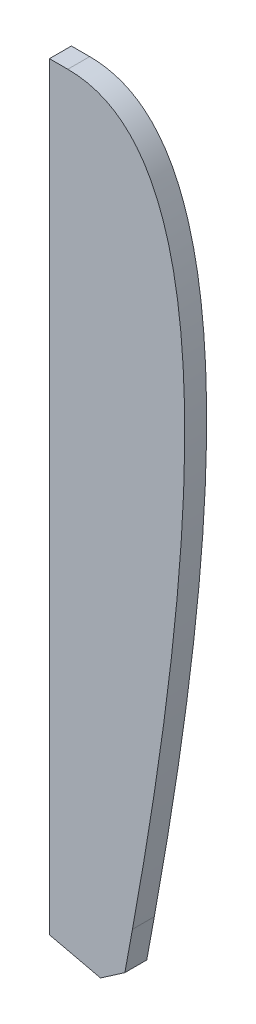
ISO-10303-21;
HEADER;
FILE_DESCRIPTION(('STEP AP214'),'2;1');
FILE_NAME('part.step','',(''),(''),'','','');
FILE_SCHEMA(('AUTOMOTIVE_DESIGN { 1 0 10303 214 1 1 1 1 }'));
ENDSEC;
DATA;
#1=APPLICATION_CONTEXT('core data for automotive mechanical design processes');
#2=APPLICATION_PROTOCOL_DEFINITION('international standard','automotive_design',2000,#1);
#3=PRODUCT_CONTEXT('',#1,'mechanical');
#4=PRODUCT('Part','Part','',(#3));
#5=PRODUCT_RELATED_PRODUCT_CATEGORY('part','',(#4));
#6=PRODUCT_DEFINITION_FORMATION('','',#4);
#7=PRODUCT_DEFINITION_CONTEXT('part definition',#1,'design');
#8=PRODUCT_DEFINITION('design','',#6,#7);
#9=PRODUCT_DEFINITION_SHAPE('','',#8);
#10=(LENGTH_UNIT() NAMED_UNIT(*) SI_UNIT(.MILLI.,.METRE.));
#11=(NAMED_UNIT(*) PLANE_ANGLE_UNIT() SI_UNIT($,.RADIAN.));
#12=(NAMED_UNIT(*) SI_UNIT($,.STERADIAN.) SOLID_ANGLE_UNIT());
#13=UNCERTAINTY_MEASURE_WITH_UNIT(LENGTH_MEASURE(1.E-05),#10,'distance_accuracy_value','');
#14=(GEOMETRIC_REPRESENTATION_CONTEXT(3) GLOBAL_UNCERTAINTY_ASSIGNED_CONTEXT((#13)) GLOBAL_UNIT_ASSIGNED_CONTEXT((#10,
#11,#12)) REPRESENTATION_CONTEXT('',''));
#15=CARTESIAN_POINT('',(0.,0.,0.));
#16=DIRECTION('',(0.,0.,1.));
#17=DIRECTION('',(1.,0.,0.));
#18=AXIS2_PLACEMENT_3D('',#15,#16,#17);
#19=CARTESIAN_POINT('',(12.7000000000002,-5480.41653499652,-12.7));
#20=DIRECTION('',(-1.,0.,0.));
#21=DIRECTION('',(0.,-1.,0.));
#22=AXIS2_PLACEMENT_3D('',#19,#20,#21);
#23=PLANE('',#22);
#24=DIRECTION('',(0.,-1.,0.));
#25=VECTOR('',#24,1.);
#26=CARTESIAN_POINT('',(12.7000000000002,-5480.41653499652,0.));
#27=LINE('',#26,#25);
#28=CARTESIAN_POINT('',(12.6999999999999,-5040.33140744906,0.));
#29=VERTEX_POINT('',#28);
#30=CARTESIAN_POINT('',(12.7000000000002,-5480.41653499652,0.));
#31=VERTEX_POINT('',#30);
#32=EDGE_CURVE('E267',#29,#31,#27,.T.);
#33=ORIENTED_EDGE('',*,*,#32,.F.);
#34=DIRECTION('',(0.,0.,1.));
#35=VECTOR('',#34,1.);
#36=CARTESIAN_POINT('',(12.6999999999999,-5040.33140744906,-12.7));
#37=LINE('',#36,#35);
#38=CARTESIAN_POINT('',(12.6999999999999,-5040.33140744906,-12.7));
#39=VERTEX_POINT('',#38);
#40=EDGE_CURVE('E109',#39,#29,#37,.T.);
#41=ORIENTED_EDGE('',*,*,#40,.F.);
#42=DIRECTION('',(0.,-1.,0.));
#43=VECTOR('',#42,1.);
#44=CARTESIAN_POINT('',(12.7000000000002,-5480.41653499652,-12.7));
#45=LINE('',#44,#43);
#46=CARTESIAN_POINT('',(12.7000000000002,-5480.41653499652,-12.7));
#47=VERTEX_POINT('',#46);
#48=EDGE_CURVE('E116',#39,#47,#45,.T.);
#49=ORIENTED_EDGE('',*,*,#48,.T.);
#50=DIRECTION('',(0.,0.,1.));
#51=VECTOR('',#50,1.);
#52=CARTESIAN_POINT('',(12.7000000000002,-5480.41653499652,-12.7));
#53=LINE('',#52,#51);
#54=EDGE_CURVE('E98',#47,#31,#53,.T.);
#55=ORIENTED_EDGE('',*,*,#54,.T.);
#56=EDGE_LOOP('',(#33,#41,#49,#55));
#57=FACE_BOUND('',#56,.T.);
#58=ADVANCED_FACE('F47',(#57),#23,.T.);
#59=CARTESIAN_POINT('',(136.525,-5040.33140744906,-12.7));
#60=DIRECTION('',(0.,1.,0.));
#61=DIRECTION('',(-1.,0.,0.));
#62=AXIS2_PLACEMENT_3D('',#59,#60,#61);
#63=PLANE('',#62);
#64=DIRECTION('',(-1.,0.,0.));
#65=VECTOR('',#64,1.);
#66=CARTESIAN_POINT('',(136.525,-5040.33140744906,0.));
#67=LINE('',#66,#65);
#68=CARTESIAN_POINT('',(23.3417092088846,-5040.33140744906,0.));
#69=VERTEX_POINT('',#68);
#70=EDGE_CURVE('E122',#69,#29,#67,.T.);
#71=ORIENTED_EDGE('',*,*,#70,.F.);
#72=CARTESIAN_POINT('',(23.3417092088846,-5040.33140744906,-13.335));
#73=CARTESIAN_POINT('',(23.3417092088846,-5040.33140744906,-8.67833333333332));
#74=CARTESIAN_POINT('',(23.3417092088846,-5040.33140744906,-4.02166666666668));
#75=CARTESIAN_POINT('',(23.3417092088846,-5040.33140744906,0.634999999999997));
#76=(BOUNDED_CURVE() B_SPLINE_CURVE(3,(#72,#73,#74,#75),.UNSPECIFIED.,.F.,
.F.) B_SPLINE_CURVE_WITH_KNOTS((4,4),(-0.000635,0.013335),
.UNSPECIFIED.) CURVE() GEOMETRIC_REPRESENTATION_ITEM() RATIONAL_B_SPLINE_CURVE((1.,1.,1.,1.)) REPRESENTATION_ITEM(''));
#77=CARTESIAN_POINT('',(23.3417092088846,-5040.33140744906,-12.7));
#78=VERTEX_POINT('',#77);
#79=EDGE_CURVE('E138',#69,#78,#76,.F.);
#80=ORIENTED_EDGE('',*,*,#79,.T.);
#81=DIRECTION('',(-1.,0.,0.));
#82=VECTOR('',#81,1.);
#83=CARTESIAN_POINT('',(136.525,-5040.33140744906,-12.7));
#84=LINE('',#83,#82);
#85=EDGE_CURVE('E110',#78,#39,#84,.T.);
#86=ORIENTED_EDGE('',*,*,#85,.T.);
#87=ORIENTED_EDGE('',*,*,#40,.T.);
#88=EDGE_LOOP('',(#71,#80,#86,#87));
#89=FACE_BOUND('',#88,.T.);
#90=ADVANCED_FACE('F176',(#89),#63,.T.);
#91=CARTESIAN_POINT('',(54.140557784839,-5490.04758870219,-12.7));
#92=DIRECTION('',(0.983631192592145,-0.180193443165269,0.));
#93=DIRECTION('',(0.180193443165269,0.983631192592145,0.));
#94=AXIS2_PLACEMENT_3D('',#91,#92,#93);
#95=PLANE('',#94);
#96=DIRECTION('',(0.180193443165269,0.983631192592145,0.));
#97=VECTOR('',#96,1.);
#98=CARTESIAN_POINT('',(54.140557784839,-5490.04758870219,0.));
#99=LINE('',#98,#97);
#100=CARTESIAN_POINT('',(56.4290145130379,-5477.55547255627,0.));
#101=VERTEX_POINT('',#100);
#102=CARTESIAN_POINT('',(60.8180576466482,-5453.59677763366,0.));
#103=VERTEX_POINT('',#102);
#104=EDGE_CURVE('E124',#101,#103,#99,.T.);
#105=ORIENTED_EDGE('',*,*,#104,.F.);
#106=DIRECTION('',(0.,0.,-1.));
#107=VECTOR('',#106,1.);
#108=CARTESIAN_POINT('',(56.4290145130379,-5477.55547255627,-12.7));
#109=LINE('',#108,#107);
#110=CARTESIAN_POINT('',(56.4290145130379,-5477.55547255627,-12.7));
#111=VERTEX_POINT('',#110);
#112=EDGE_CURVE('E55',#101,#111,#109,.T.);
#113=ORIENTED_EDGE('',*,*,#112,.T.);
#114=DIRECTION('',(0.180193443165269,0.983631192592145,0.));
#115=VECTOR('',#114,1.);
#116=CARTESIAN_POINT('',(54.140557784839,-5490.04758870219,-12.7));
#117=LINE('',#116,#115);
#118=CARTESIAN_POINT('',(60.818057646648,-5453.59677763366,-12.7));
#119=VERTEX_POINT('',#118);
#120=EDGE_CURVE('E118',#111,#119,#117,.T.);
#121=ORIENTED_EDGE('',*,*,#120,.T.);
#122=CARTESIAN_POINT('',(60.8180576466482,-5453.59677763366,0.634999999999997));
#123=CARTESIAN_POINT('',(60.8180576466482,-5453.59677763366,-4.02166666666668));
#124=CARTESIAN_POINT('',(60.8180576466482,-5453.59677763366,-8.67833333333332));
#125=CARTESIAN_POINT('',(60.8180576466482,-5453.59677763366,-13.335));
#126=(BOUNDED_CURVE() B_SPLINE_CURVE(3,(#122,#123,#124,#125),.UNSPECIFIED.,.F.,
.F.) B_SPLINE_CURVE_WITH_KNOTS((4,4),(-0.000635,0.013335),
.UNSPECIFIED.) CURVE() GEOMETRIC_REPRESENTATION_ITEM() RATIONAL_B_SPLINE_CURVE((1.,1.,1.,1.)) REPRESENTATION_ITEM(''));
#127=EDGE_CURVE('E266',#119,#103,#126,.F.);
#128=ORIENTED_EDGE('',*,*,#127,.T.);
#129=EDGE_LOOP('',(#105,#113,#121,#128));
#130=FACE_BOUND('',#129,.T.);
#131=ADVANCED_FACE('F179',(#130),#95,.T.);
#132=CARTESIAN_POINT('',(12.7000000000002,-5480.41653499652,-12.7));
#133=DIRECTION('',(-0.226373338950906,-0.974040610761285,0.));
#134=DIRECTION('',(0.974040610761285,-0.226373338950906,0.));
#135=AXIS2_PLACEMENT_3D('',#132,#133,#134);
#136=PLANE('',#135);
#137=DIRECTION('',(0.974040610761285,-0.226373338950906,0.));
#138=VECTOR('',#137,1.);
#139=CARTESIAN_POINT('',(12.7000000000002,-5480.41653499652,-12.7));
#140=LINE('',#139,#138);
#141=CARTESIAN_POINT('',(42.3147027943785,-5487.29918350166,-12.7));
#142=VERTEX_POINT('',#141);
#143=EDGE_CURVE('E102',#47,#142,#140,.T.);
#144=ORIENTED_EDGE('',*,*,#143,.T.);
#145=DIRECTION('',(0.,0.,1.));
#146=VECTOR('',#145,1.);
#147=CARTESIAN_POINT('',(42.3147027943785,-5487.29918350166,-12.7));
#148=LINE('',#147,#146);
#149=CARTESIAN_POINT('',(42.3147027943785,-5487.29918350166,0.));
#150=VERTEX_POINT('',#149);
#151=EDGE_CURVE('E134',#142,#150,#148,.T.);
#152=ORIENTED_EDGE('',*,*,#151,.T.);
#153=DIRECTION('',(0.974040610761285,-0.226373338950906,0.));
#154=VECTOR('',#153,1.);
#155=CARTESIAN_POINT('',(12.7000000000002,-5480.41653499652,0.));
#156=LINE('',#155,#154);
#157=EDGE_CURVE('E104',#31,#150,#156,.T.);
#158=ORIENTED_EDGE('',*,*,#157,.F.);
#159=ORIENTED_EDGE('',*,*,#54,.F.);
#160=EDGE_LOOP('',(#144,#152,#158,#159));
#161=FACE_BOUND('',#160,.T.);
#162=ADVANCED_FACE('F100',(#161),#136,.T.);
#163=CARTESIAN_POINT('',(0.,0.,-12.7));
#164=DIRECTION('',(0.,0.,1.));
#165=DIRECTION('',(1.,0.,0.));
#166=AXIS2_PLACEMENT_3D('',#163,#164,#165);
#167=PLANE('',#166);
#168=ORIENTED_EDGE('',*,*,#120,.F.);
#169=DIRECTION('',(0.822948292056027,0.568116280881007,0.));
#170=VECTOR('',#169,1.);
#171=CARTESIAN_POINT('',(42.3147027943786,-5487.29918350166,-12.7));
#172=LINE('',#171,#170);
#173=EDGE_CURVE('E13',#111,#142,#172,.F.);
#174=ORIENTED_EDGE('',*,*,#173,.T.);
#175=ORIENTED_EDGE('',*,*,#143,.F.);
#176=ORIENTED_EDGE('',*,*,#48,.F.);
#177=ORIENTED_EDGE('',*,*,#85,.F.);
#178=CARTESIAN_POINT('',(60.8180576466482,-5453.59677763366,-12.7));
#179=CARTESIAN_POINT('',(136.525000000004,-5040.33140744906,-12.7));
#180=CARTESIAN_POINT('',(23.3417092088846,-5040.33140744906,-12.7));
#181=(BOUNDED_CURVE() B_SPLINE_CURVE(2,(#178,#179,#180),.UNSPECIFIED.,.F.,
.F.) B_SPLINE_CURVE_WITH_KNOTS((3,3),(0.,1.),
.UNSPECIFIED.) CURVE() GEOMETRIC_REPRESENTATION_ITEM() RATIONAL_B_SPLINE_CURVE((1.,1.,1.)) REPRESENTATION_ITEM(''));
#182=EDGE_CURVE('E135',#78,#119,#181,.F.);
#183=ORIENTED_EDGE('',*,*,#182,.T.);
#184=EDGE_LOOP('',(#168,#174,#175,#176,#177,#183));
#185=FACE_BOUND('',#184,.T.);
#186=ADVANCED_FACE('F114',(#185),#167,.F.);
#187=CARTESIAN_POINT('',(0.,0.,0.));
#188=DIRECTION('',(0.,0.,1.));
#189=DIRECTION('',(1.,0.,0.));
#190=AXIS2_PLACEMENT_3D('',#187,#188,#189);
#191=PLANE('',#190);
#192=ORIENTED_EDGE('',*,*,#157,.T.);
#193=DIRECTION('',(-0.822948292056027,-0.568116280881007,0.));
#194=VECTOR('',#193,1.);
#195=CARTESIAN_POINT('',(2579.13608869158,-3736.02325896617,0.));
#196=LINE('',#195,#194);
#197=EDGE_CURVE('E69',#150,#101,#196,.F.);
#198=ORIENTED_EDGE('',*,*,#197,.T.);
#199=ORIENTED_EDGE('',*,*,#104,.T.);
#200=CARTESIAN_POINT('',(23.3417092088846,-5040.33140744906,0.));
#201=CARTESIAN_POINT('',(136.525000000004,-5040.33140744906,0.));
#202=CARTESIAN_POINT('',(60.8180576466482,-5453.59677763366,0.));
#203=(BOUNDED_CURVE() B_SPLINE_CURVE(2,(#200,#201,#202),.UNSPECIFIED.,.F.,
.F.) B_SPLINE_CURVE_WITH_KNOTS((3,3),(0.,1.),
.UNSPECIFIED.) CURVE() GEOMETRIC_REPRESENTATION_ITEM() RATIONAL_B_SPLINE_CURVE((1.,1.,1.)) REPRESENTATION_ITEM(''));
#204=EDGE_CURVE('E157',#103,#69,#203,.F.);
#205=ORIENTED_EDGE('',*,*,#204,.T.);
#206=ORIENTED_EDGE('',*,*,#70,.T.);
#207=ORIENTED_EDGE('',*,*,#32,.T.);
#208=EDGE_LOOP('',(#192,#198,#199,#205,#206,#207));
#209=FACE_BOUND('',#208,.T.);
#210=ADVANCED_FACE('F164',(#209),#191,.T.);
#211=CARTESIAN_POINT('',(60.8180576466482,-5453.59677763366,-13.335));
#212=CARTESIAN_POINT('',(60.8180576466482,-5453.59677763366,-8.67833333333332));
#213=CARTESIAN_POINT('',(60.8180576466482,-5453.59677763366,-4.02166666666668));
#214=CARTESIAN_POINT('',(60.8180576466482,-5453.59677763366,0.634999999999997));
#215=CARTESIAN_POINT('',(136.525000000004,-5040.33140744906,-13.335));
#216=CARTESIAN_POINT('',(136.525000000004,-5040.33140744906,-8.67833333333332));
#217=CARTESIAN_POINT('',(136.525000000004,-5040.33140744906,-4.02166666666668));
#218=CARTESIAN_POINT('',(136.525000000004,-5040.33140744906,0.634999999999997));
#219=CARTESIAN_POINT('',(23.3417092088846,-5040.33140744906,-13.335));
#220=CARTESIAN_POINT('',(23.3417092088846,-5040.33140744906,-8.67833333333332));
#221=CARTESIAN_POINT('',(23.3417092088846,-5040.33140744906,-4.02166666666668));
#222=CARTESIAN_POINT('',(23.3417092088846,-5040.33140744906,0.634999999999997));
#223=(BOUNDED_SURFACE() B_SPLINE_SURFACE(2,3,((#211,#212,#213,#214),(#215,#216,#217,#218),(#219,
#220,#221,#222)),.UNSPECIFIED.,.F.,.F.,.F.) B_SPLINE_SURFACE_WITH_KNOTS((3,3),(4,4),(0.,1.),
(-0.000635,0.013335),
.UNSPECIFIED.) GEOMETRIC_REPRESENTATION_ITEM() RATIONAL_B_SPLINE_SURFACE(((1.,1.,1.,1.),(1.,1.,
1.,1.),(1.,1.,1.,1.))) REPRESENTATION_ITEM('') SURFACE());
#224=ORIENTED_EDGE('',*,*,#182,.F.);
#225=ORIENTED_EDGE('',*,*,#79,.F.);
#226=ORIENTED_EDGE('',*,*,#204,.F.);
#227=ORIENTED_EDGE('',*,*,#127,.F.);
#228=EDGE_LOOP('',(#224,#225,#226,#227));
#229=FACE_BOUND('',#228,.T.);
#230=ADVANCED_FACE('F174',(#229),#223,.T.);
#231=CARTESIAN_POINT('',(42.3147027943786,-5487.29918350166,-12.7));
#232=DIRECTION('',(-0.568116280881007,0.822948292056027,0.));
#233=DIRECTION('',(0.,0.,1.));
#234=AXIS2_PLACEMENT_3D('',#231,#232,#233);
#235=PLANE('',#234);
#236=ORIENTED_EDGE('',*,*,#173,.F.);
#237=ORIENTED_EDGE('',*,*,#112,.F.);
#238=ORIENTED_EDGE('',*,*,#197,.F.);
#239=ORIENTED_EDGE('',*,*,#151,.F.);
#240=EDGE_LOOP('',(#236,#237,#238,#239));
#241=FACE_BOUND('',#240,.T.);
#242=ADVANCED_FACE('F49',(#241),#235,.F.);
#243=CLOSED_SHELL('',(#58,#90,#131,#162,#186,#210,#230,#242));
#244=MANIFOLD_SOLID_BREP('B2',#243);
#245=ADVANCED_BREP_SHAPE_REPRESENTATION('',(#18,#244),#14);
#246=SHAPE_DEFINITION_REPRESENTATION(#9,#245);
ENDSEC;
END-ISO-10303-21;
